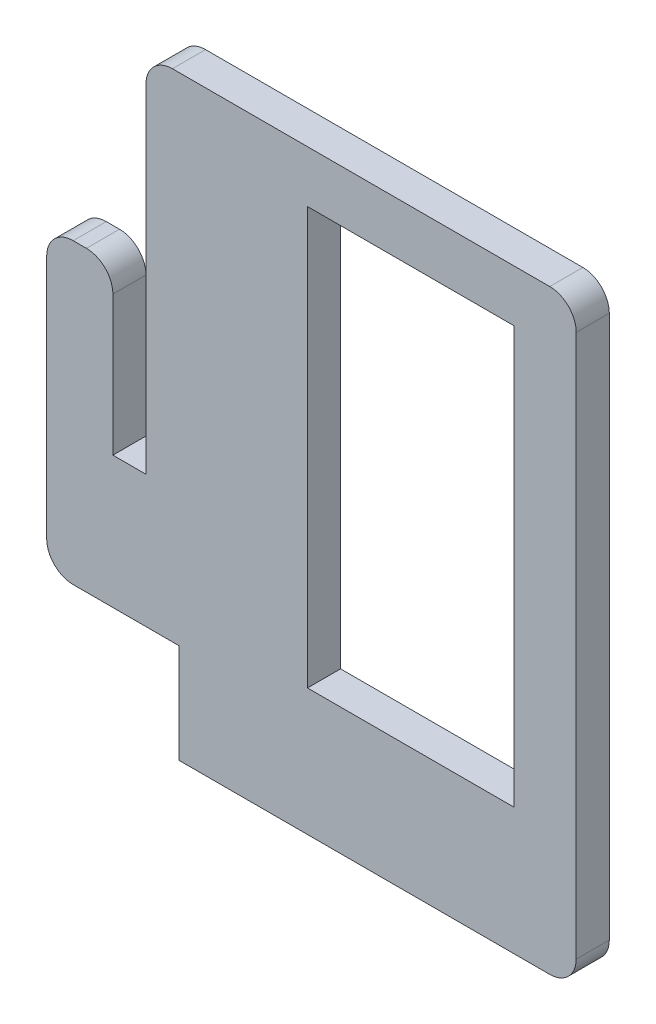
ISO-10303-21;
HEADER;
FILE_DESCRIPTION(('STEP AP214'),'2;1');
FILE_NAME('part.step','',(''),(''),'','','');
FILE_SCHEMA(('AUTOMOTIVE_DESIGN { 1 0 10303 214 1 1 1 1 }'));
ENDSEC;
DATA;
#1=APPLICATION_CONTEXT('core data for automotive mechanical design processes');
#2=APPLICATION_PROTOCOL_DEFINITION('international standard','automotive_design',2000,#1);
#3=PRODUCT_CONTEXT('',#1,'mechanical');
#4=PRODUCT('Part','Part','',(#3));
#5=PRODUCT_RELATED_PRODUCT_CATEGORY('part','',(#4));
#6=PRODUCT_DEFINITION_FORMATION('','',#4);
#7=PRODUCT_DEFINITION_CONTEXT('part definition',#1,'design');
#8=PRODUCT_DEFINITION('design','',#6,#7);
#9=PRODUCT_DEFINITION_SHAPE('','',#8);
#10=(LENGTH_UNIT() NAMED_UNIT(*) SI_UNIT(.MILLI.,.METRE.));
#11=(NAMED_UNIT(*) PLANE_ANGLE_UNIT() SI_UNIT($,.RADIAN.));
#12=(NAMED_UNIT(*) SI_UNIT($,.STERADIAN.) SOLID_ANGLE_UNIT());
#13=UNCERTAINTY_MEASURE_WITH_UNIT(LENGTH_MEASURE(1.E-05),#10,'distance_accuracy_value','');
#14=(GEOMETRIC_REPRESENTATION_CONTEXT(3) GLOBAL_UNCERTAINTY_ASSIGNED_CONTEXT((#13)) GLOBAL_UNIT_ASSIGNED_CONTEXT((#10,
#11,#12)) REPRESENTATION_CONTEXT('',''));
#15=CARTESIAN_POINT('',(0.,0.,0.));
#16=DIRECTION('',(0.,0.,1.));
#17=DIRECTION('',(1.,0.,0.));
#18=AXIS2_PLACEMENT_3D('',#15,#16,#17);
#19=CARTESIAN_POINT('',(0.,0.,3.175));
#20=DIRECTION('',(0.,0.,-1.));
#21=DIRECTION('',(-1.,0.,0.));
#22=AXIS2_PLACEMENT_3D('',#19,#20,#21);
#23=PLANE('',#22);
#24=DIRECTION('',(0.,-1.,0.));
#25=VECTOR('',#24,1.);
#26=CARTESIAN_POINT('',(0.,9.52499999999999,3.175));
#27=LINE('',#26,#25);
#28=CARTESIAN_POINT('',(0.,35.56,3.175));
#29=VERTEX_POINT('',#28);
#30=CARTESIAN_POINT('',(0.,12.065,3.175));
#31=VERTEX_POINT('',#30);
#32=EDGE_CURVE('E230',#29,#31,#27,.T.);
#33=ORIENTED_EDGE('',*,*,#32,.T.);
#34=CARTESIAN_POINT('',(2.54,12.065,3.175));
#35=DIRECTION('',(0.,0.,-1.));
#36=DIRECTION('',(-1.,0.,0.));
#37=AXIS2_PLACEMENT_3D('',#34,#35,#36);
#38=CIRCLE('',#37,2.54);
#39=CARTESIAN_POINT('',(2.54,9.52499999999999,3.175));
#40=VERTEX_POINT('',#39);
#41=EDGE_CURVE('E303',#31,#40,#38,.F.);
#42=ORIENTED_EDGE('',*,*,#41,.T.);
#43=DIRECTION('',(1.,0.,0.));
#44=VECTOR('',#43,1.);
#45=CARTESIAN_POINT('',(0.,9.52499999999999,3.175));
#46=LINE('',#45,#44);
#47=CARTESIAN_POINT('',(12.7,9.52499999999999,3.175));
#48=VERTEX_POINT('',#47);
#49=EDGE_CURVE('E233',#40,#48,#46,.T.);
#50=ORIENTED_EDGE('',*,*,#49,.T.);
#51=DIRECTION('',(0.,-1.,0.));
#52=VECTOR('',#51,1.);
#53=CARTESIAN_POINT('',(12.7,0.,3.175));
#54=LINE('',#53,#52);
#55=CARTESIAN_POINT('',(12.7,0.,3.175));
#56=VERTEX_POINT('',#55);
#57=EDGE_CURVE('E235',#48,#56,#54,.T.);
#58=ORIENTED_EDGE('',*,*,#57,.T.);
#59=DIRECTION('',(1.,0.,0.));
#60=VECTOR('',#59,1.);
#61=CARTESIAN_POINT('',(12.7,0.,3.175));
#62=LINE('',#61,#60);
#63=CARTESIAN_POINT('',(48.26,0.,3.175));
#64=VERTEX_POINT('',#63);
#65=EDGE_CURVE('E237',#56,#64,#62,.T.);
#66=ORIENTED_EDGE('',*,*,#65,.T.);
#67=CARTESIAN_POINT('',(48.26,2.53999999999999,3.175));
#68=DIRECTION('',(0.,0.,-1.));
#69=DIRECTION('',(-1.,0.,0.));
#70=AXIS2_PLACEMENT_3D('',#67,#68,#69);
#71=CIRCLE('',#70,2.54);
#72=CARTESIAN_POINT('',(50.8,2.53999999999999,3.175));
#73=VERTEX_POINT('',#72);
#74=EDGE_CURVE('E295',#64,#73,#71,.F.);
#75=ORIENTED_EDGE('',*,*,#74,.T.);
#76=DIRECTION('',(0.,1.,0.));
#77=VECTOR('',#76,1.);
#78=CARTESIAN_POINT('',(50.8,38.1,3.175));
#79=LINE('',#78,#77);
#80=CARTESIAN_POINT('',(50.8,54.61,3.175));
#81=VERTEX_POINT('',#80);
#82=EDGE_CURVE('E214',#73,#81,#79,.T.);
#83=ORIENTED_EDGE('',*,*,#82,.T.);
#84=CARTESIAN_POINT('',(48.26,54.61,3.175));
#85=DIRECTION('',(0.,0.,-1.));
#86=DIRECTION('',(-1.,0.,0.));
#87=AXIS2_PLACEMENT_3D('',#84,#85,#86);
#88=CIRCLE('',#87,2.54);
#89=CARTESIAN_POINT('',(48.26,57.15,3.175));
#90=VERTEX_POINT('',#89);
#91=EDGE_CURVE('E293',#81,#90,#88,.F.);
#92=ORIENTED_EDGE('',*,*,#91,.T.);
#93=DIRECTION('',(-1.,0.,0.));
#94=VECTOR('',#93,1.);
#95=CARTESIAN_POINT('',(9.525,57.15,3.175));
#96=LINE('',#95,#94);
#97=CARTESIAN_POINT('',(12.065,57.15,3.175));
#98=VERTEX_POINT('',#97);
#99=EDGE_CURVE('E217',#90,#98,#96,.T.);
#100=ORIENTED_EDGE('',*,*,#99,.T.);
#101=CARTESIAN_POINT('',(12.065,54.61,3.175));
#102=DIRECTION('',(0.,0.,-1.));
#103=DIRECTION('',(-1.,0.,0.));
#104=AXIS2_PLACEMENT_3D('',#101,#102,#103);
#105=CIRCLE('',#104,2.54);
#106=CARTESIAN_POINT('',(9.525,54.61,3.175));
#107=VERTEX_POINT('',#106);
#108=EDGE_CURVE('E297',#98,#107,#105,.F.);
#109=ORIENTED_EDGE('',*,*,#108,.T.);
#110=DIRECTION('',(0.,-1.,0.));
#111=VECTOR('',#110,1.);
#112=CARTESIAN_POINT('',(9.525,38.1,3.175));
#113=LINE('',#112,#111);
#114=CARTESIAN_POINT('',(9.525,22.1847852625298,3.175));
#115=VERTEX_POINT('',#114);
#116=EDGE_CURVE('E221',#107,#115,#113,.T.);
#117=ORIENTED_EDGE('',*,*,#116,.T.);
#118=DIRECTION('',(-1.,0.,0.));
#119=VECTOR('',#118,1.);
#120=CARTESIAN_POINT('',(6.35,22.1847852625298,3.175));
#121=LINE('',#120,#119);
#122=CARTESIAN_POINT('',(6.35,22.1847852625298,3.175));
#123=VERTEX_POINT('',#122);
#124=EDGE_CURVE('E223',#115,#123,#121,.T.);
#125=ORIENTED_EDGE('',*,*,#124,.T.);
#126=DIRECTION('',(0.,1.,0.));
#127=VECTOR('',#126,1.);
#128=CARTESIAN_POINT('',(6.35,38.1,3.175));
#129=LINE('',#128,#127);
#130=CARTESIAN_POINT('',(6.35,35.56,3.175));
#131=VERTEX_POINT('',#130);
#132=EDGE_CURVE('E225',#123,#131,#129,.T.);
#133=ORIENTED_EDGE('',*,*,#132,.T.);
#134=CARTESIAN_POINT('',(3.81,35.56,3.175));
#135=DIRECTION('',(0.,0.,-1.));
#136=DIRECTION('',(-1.,0.,0.));
#137=AXIS2_PLACEMENT_3D('',#134,#135,#136);
#138=CIRCLE('',#137,2.54);
#139=CARTESIAN_POINT('',(3.81,38.1,3.175));
#140=VERTEX_POINT('',#139);
#141=EDGE_CURVE('E301',#131,#140,#138,.F.);
#142=ORIENTED_EDGE('',*,*,#141,.T.);
#143=DIRECTION('',(-1.,0.,0.));
#144=VECTOR('',#143,1.);
#145=CARTESIAN_POINT('',(0.,38.1,3.175));
#146=LINE('',#145,#144);
#147=CARTESIAN_POINT('',(2.54,38.1,3.175));
#148=VERTEX_POINT('',#147);
#149=EDGE_CURVE('E228',#140,#148,#146,.T.);
#150=ORIENTED_EDGE('',*,*,#149,.T.);
#151=CARTESIAN_POINT('',(2.54,35.56,3.175));
#152=DIRECTION('',(0.,0.,-1.));
#153=DIRECTION('',(-1.,0.,0.));
#154=AXIS2_PLACEMENT_3D('',#151,#152,#153);
#155=CIRCLE('',#154,2.54);
#156=EDGE_CURVE('E299',#148,#29,#155,.F.);
#157=ORIENTED_EDGE('',*,*,#156,.T.);
#158=EDGE_LOOP('',(#33,#42,#50,#58,#66,#75,#83,#92,#100,#109,#117,#125,#133,#142,#150,#157));
#159=FACE_BOUND('',#158,.T.);
#160=DIRECTION('',(0.,1.,0.));
#161=VECTOR('',#160,1.);
#162=CARTESIAN_POINT('',(44.831,52.1771852625298,3.175));
#163=LINE('',#162,#161);
#164=CARTESIAN_POINT('',(44.831,12.1771852625298,3.175));
#165=VERTEX_POINT('',#164);
#166=CARTESIAN_POINT('',(44.831,52.1771852625298,3.175));
#167=VERTEX_POINT('',#166);
#168=EDGE_CURVE('E173',#165,#167,#163,.T.);
#169=ORIENTED_EDGE('',*,*,#168,.F.);
#170=DIRECTION('',(1.,0.,0.));
#171=VECTOR('',#170,1.);
#172=CARTESIAN_POINT('',(25.019,12.1771852625298,3.175));
#173=LINE('',#172,#171);
#174=CARTESIAN_POINT('',(25.019,12.1771852625298,3.175));
#175=VERTEX_POINT('',#174);
#176=EDGE_CURVE('E198',#175,#165,#173,.T.);
#177=ORIENTED_EDGE('',*,*,#176,.F.);
#178=DIRECTION('',(0.,-1.,0.));
#179=VECTOR('',#178,1.);
#180=CARTESIAN_POINT('',(25.019,52.1771852625298,3.175));
#181=LINE('',#180,#179);
#182=CARTESIAN_POINT('',(25.019,52.1771852625298,3.175));
#183=VERTEX_POINT('',#182);
#184=EDGE_CURVE('E196',#183,#175,#181,.T.);
#185=ORIENTED_EDGE('',*,*,#184,.F.);
#186=DIRECTION('',(-1.,0.,0.));
#187=VECTOR('',#186,1.);
#188=CARTESIAN_POINT('',(25.019,52.1771852625298,3.175));
#189=LINE('',#188,#187);
#190=EDGE_CURVE('E183',#167,#183,#189,.T.);
#191=ORIENTED_EDGE('',*,*,#190,.F.);
#192=EDGE_LOOP('',(#169,#177,#185,#191));
#193=FACE_BOUND('',#192,.T.);
#194=ADVANCED_FACE('F33',(#159,#193),#23,.F.);
#195=CARTESIAN_POINT('',(0.,0.,0.));
#196=DIRECTION('',(0.,0.,-1.));
#197=DIRECTION('',(-1.,0.,0.));
#198=AXIS2_PLACEMENT_3D('',#195,#196,#197);
#199=PLANE('',#198);
#200=DIRECTION('',(1.,0.,0.));
#201=VECTOR('',#200,1.);
#202=CARTESIAN_POINT('',(0.,9.52499999999999,0.));
#203=LINE('',#202,#201);
#204=CARTESIAN_POINT('',(2.54,9.52499999999999,0.));
#205=VERTEX_POINT('',#204);
#206=CARTESIAN_POINT('',(12.7,9.52499999999999,0.));
#207=VERTEX_POINT('',#206);
#208=EDGE_CURVE('E254',#205,#207,#203,.T.);
#209=ORIENTED_EDGE('',*,*,#208,.F.);
#210=CARTESIAN_POINT('',(2.54,12.065,0.));
#211=DIRECTION('',(0.,0.,-1.));
#212=DIRECTION('',(-1.,0.,0.));
#213=AXIS2_PLACEMENT_3D('',#210,#211,#212);
#214=CIRCLE('',#213,2.54);
#215=CARTESIAN_POINT('',(0.,12.065,0.));
#216=VERTEX_POINT('',#215);
#217=EDGE_CURVE('E286',#205,#216,#214,.T.);
#218=ORIENTED_EDGE('',*,*,#217,.T.);
#219=DIRECTION('',(0.,-1.,0.));
#220=VECTOR('',#219,1.);
#221=CARTESIAN_POINT('',(0.,9.52499999999999,0.));
#222=LINE('',#221,#220);
#223=CARTESIAN_POINT('',(0.,35.56,0.));
#224=VERTEX_POINT('',#223);
#225=EDGE_CURVE('E251',#224,#216,#222,.T.);
#226=ORIENTED_EDGE('',*,*,#225,.F.);
#227=CARTESIAN_POINT('',(2.54,35.56,0.));
#228=DIRECTION('',(0.,0.,-1.));
#229=DIRECTION('',(-1.,0.,0.));
#230=AXIS2_PLACEMENT_3D('',#227,#228,#229);
#231=CIRCLE('',#230,2.54);
#232=CARTESIAN_POINT('',(2.54,38.1,0.));
#233=VERTEX_POINT('',#232);
#234=EDGE_CURVE('E282',#224,#233,#231,.T.);
#235=ORIENTED_EDGE('',*,*,#234,.T.);
#236=DIRECTION('',(-1.,0.,0.));
#237=VECTOR('',#236,1.);
#238=CARTESIAN_POINT('',(0.,38.1,0.));
#239=LINE('',#238,#237);
#240=CARTESIAN_POINT('',(3.81,38.1,0.));
#241=VERTEX_POINT('',#240);
#242=EDGE_CURVE('E249',#241,#233,#239,.T.);
#243=ORIENTED_EDGE('',*,*,#242,.F.);
#244=CARTESIAN_POINT('',(3.81,35.56,0.));
#245=DIRECTION('',(0.,0.,-1.));
#246=DIRECTION('',(-1.,0.,0.));
#247=AXIS2_PLACEMENT_3D('',#244,#245,#246);
#248=CIRCLE('',#247,2.54);
#249=CARTESIAN_POINT('',(6.35,35.56,0.));
#250=VERTEX_POINT('',#249);
#251=EDGE_CURVE('E284',#241,#250,#248,.T.);
#252=ORIENTED_EDGE('',*,*,#251,.T.);
#253=DIRECTION('',(0.,1.,0.));
#254=VECTOR('',#253,1.);
#255=CARTESIAN_POINT('',(6.35,38.1,0.));
#256=LINE('',#255,#254);
#257=CARTESIAN_POINT('',(6.35,22.1847852625298,0.));
#258=VERTEX_POINT('',#257);
#259=EDGE_CURVE('E246',#258,#250,#256,.T.);
#260=ORIENTED_EDGE('',*,*,#259,.F.);
#261=DIRECTION('',(-1.,0.,0.));
#262=VECTOR('',#261,1.);
#263=CARTESIAN_POINT('',(6.35,22.1847852625298,0.));
#264=LINE('',#263,#262);
#265=CARTESIAN_POINT('',(9.525,22.1847852625298,0.));
#266=VERTEX_POINT('',#265);
#267=EDGE_CURVE('E244',#266,#258,#264,.T.);
#268=ORIENTED_EDGE('',*,*,#267,.F.);
#269=DIRECTION('',(0.,-1.,0.));
#270=VECTOR('',#269,1.);
#271=CARTESIAN_POINT('',(9.525,38.1,0.));
#272=LINE('',#271,#270);
#273=CARTESIAN_POINT('',(9.525,54.61,0.));
#274=VERTEX_POINT('',#273);
#275=EDGE_CURVE('E242',#274,#266,#272,.T.);
#276=ORIENTED_EDGE('',*,*,#275,.F.);
#277=CARTESIAN_POINT('',(12.065,54.61,0.));
#278=DIRECTION('',(0.,0.,-1.));
#279=DIRECTION('',(-1.,0.,0.));
#280=AXIS2_PLACEMENT_3D('',#277,#278,#279);
#281=CIRCLE('',#280,2.54);
#282=CARTESIAN_POINT('',(12.065,57.15,0.));
#283=VERTEX_POINT('',#282);
#284=EDGE_CURVE('E280',#274,#283,#281,.T.);
#285=ORIENTED_EDGE('',*,*,#284,.T.);
#286=DIRECTION('',(-1.,0.,0.));
#287=VECTOR('',#286,1.);
#288=CARTESIAN_POINT('',(9.525,57.15,0.));
#289=LINE('',#288,#287);
#290=CARTESIAN_POINT('',(48.26,57.15,0.));
#291=VERTEX_POINT('',#290);
#292=EDGE_CURVE('E191',#291,#283,#289,.T.);
#293=ORIENTED_EDGE('',*,*,#292,.F.);
#294=CARTESIAN_POINT('',(48.26,54.61,0.));
#295=DIRECTION('',(0.,0.,-1.));
#296=DIRECTION('',(-1.,0.,0.));
#297=AXIS2_PLACEMENT_3D('',#294,#295,#296);
#298=CIRCLE('',#297,2.54);
#299=CARTESIAN_POINT('',(50.8,54.61,0.));
#300=VERTEX_POINT('',#299);
#301=EDGE_CURVE('E276',#291,#300,#298,.T.);
#302=ORIENTED_EDGE('',*,*,#301,.T.);
#303=DIRECTION('',(0.,1.,0.));
#304=VECTOR('',#303,1.);
#305=CARTESIAN_POINT('',(50.8,0.,0.));
#306=LINE('',#305,#304);
#307=CARTESIAN_POINT('',(50.8,2.53999999999999,0.));
#308=VERTEX_POINT('',#307);
#309=EDGE_CURVE('E218',#308,#300,#306,.T.);
#310=ORIENTED_EDGE('',*,*,#309,.F.);
#311=CARTESIAN_POINT('',(48.26,2.53999999999999,0.));
#312=DIRECTION('',(0.,0.,-1.));
#313=DIRECTION('',(-1.,0.,0.));
#314=AXIS2_PLACEMENT_3D('',#311,#312,#313);
#315=CIRCLE('',#314,2.54);
#316=CARTESIAN_POINT('',(48.26,0.,0.));
#317=VERTEX_POINT('',#316);
#318=EDGE_CURVE('E278',#308,#317,#315,.T.);
#319=ORIENTED_EDGE('',*,*,#318,.T.);
#320=DIRECTION('',(1.,0.,0.));
#321=VECTOR('',#320,1.);
#322=CARTESIAN_POINT('',(12.7,0.,0.));
#323=LINE('',#322,#321);
#324=CARTESIAN_POINT('',(12.7,0.,0.));
#325=VERTEX_POINT('',#324);
#326=EDGE_CURVE('E258',#325,#317,#323,.T.);
#327=ORIENTED_EDGE('',*,*,#326,.F.);
#328=DIRECTION('',(0.,-1.,0.));
#329=VECTOR('',#328,1.);
#330=CARTESIAN_POINT('',(12.7,0.,0.));
#331=LINE('',#330,#329);
#332=EDGE_CURVE('E256',#207,#325,#331,.T.);
#333=ORIENTED_EDGE('',*,*,#332,.F.);
#334=EDGE_LOOP('',(#209,#218,#226,#235,#243,#252,#260,#268,#276,#285,#293,#302,#310,#319,#327,#333));
#335=FACE_BOUND('',#334,.T.);
#336=DIRECTION('',(1.,0.,0.));
#337=VECTOR('',#336,1.);
#338=CARTESIAN_POINT('',(25.019,12.1771852625298,0.));
#339=LINE('',#338,#337);
#340=CARTESIAN_POINT('',(25.019,12.1771852625298,0.));
#341=VERTEX_POINT('',#340);
#342=CARTESIAN_POINT('',(44.831,12.1771852625298,0.));
#343=VERTEX_POINT('',#342);
#344=EDGE_CURVE('E184',#341,#343,#339,.T.);
#345=ORIENTED_EDGE('',*,*,#344,.T.);
#346=DIRECTION('',(0.,1.,0.));
#347=VECTOR('',#346,1.);
#348=CARTESIAN_POINT('',(44.831,52.1771852625298,0.));
#349=LINE('',#348,#347);
#350=CARTESIAN_POINT('',(44.831,52.1771852625298,0.));
#351=VERTEX_POINT('',#350);
#352=EDGE_CURVE('E202',#343,#351,#349,.T.);
#353=ORIENTED_EDGE('',*,*,#352,.T.);
#354=DIRECTION('',(-1.,0.,0.));
#355=VECTOR('',#354,1.);
#356=CARTESIAN_POINT('',(25.019,52.1771852625298,0.));
#357=LINE('',#356,#355);
#358=CARTESIAN_POINT('',(25.019,52.1771852625298,0.));
#359=VERTEX_POINT('',#358);
#360=EDGE_CURVE('E190',#351,#359,#357,.T.);
#361=ORIENTED_EDGE('',*,*,#360,.T.);
#362=DIRECTION('',(0.,-1.,0.));
#363=VECTOR('',#362,1.);
#364=CARTESIAN_POINT('',(25.019,52.1771852625298,0.));
#365=LINE('',#364,#363);
#366=EDGE_CURVE('E205',#359,#341,#365,.T.);
#367=ORIENTED_EDGE('',*,*,#366,.T.);
#368=EDGE_LOOP('',(#345,#353,#361,#367));
#369=FACE_BOUND('',#368,.T.);
#370=ADVANCED_FACE('F331',(#335,#369),#199,.T.);
#371=CARTESIAN_POINT('',(9.525,57.15,3.175));
#372=DIRECTION('',(0.,-1.,0.));
#373=DIRECTION('',(0.,0.,-1.));
#374=AXIS2_PLACEMENT_3D('',#371,#372,#373);
#375=PLANE('',#374);
#376=ORIENTED_EDGE('',*,*,#292,.T.);
#377=DIRECTION('',(0.,0.,-1.));
#378=VECTOR('',#377,1.);
#379=CARTESIAN_POINT('',(12.065,57.15,3.175));
#380=LINE('',#379,#378);
#381=EDGE_CURVE('E317',#283,#98,#380,.F.);
#382=ORIENTED_EDGE('',*,*,#381,.T.);
#383=ORIENTED_EDGE('',*,*,#99,.F.);
#384=DIRECTION('',(0.,0.,-1.));
#385=VECTOR('',#384,1.);
#386=CARTESIAN_POINT('',(48.26,57.15,3.175));
#387=LINE('',#386,#385);
#388=EDGE_CURVE('E314',#90,#291,#387,.T.);
#389=ORIENTED_EDGE('',*,*,#388,.T.);
#390=EDGE_LOOP('',(#376,#382,#383,#389));
#391=FACE_BOUND('',#390,.T.);
#392=ADVANCED_FACE('F340',(#391),#375,.F.);
#393=CARTESIAN_POINT('',(9.525,38.1,3.175));
#394=DIRECTION('',(1.,0.,0.));
#395=DIRECTION('',(0.,1.,0.));
#396=AXIS2_PLACEMENT_3D('',#393,#394,#395);
#397=PLANE('',#396);
#398=ORIENTED_EDGE('',*,*,#116,.F.);
#399=DIRECTION('',(0.,0.,-1.));
#400=VECTOR('',#399,1.);
#401=CARTESIAN_POINT('',(9.525,54.61,3.175));
#402=LINE('',#401,#400);
#403=EDGE_CURVE('E311',#107,#274,#402,.T.);
#404=ORIENTED_EDGE('',*,*,#403,.T.);
#405=ORIENTED_EDGE('',*,*,#275,.T.);
#406=DIRECTION('',(0.,0.,-1.));
#407=VECTOR('',#406,1.);
#408=CARTESIAN_POINT('',(9.525,22.1847852625298,3.175));
#409=LINE('',#408,#407);
#410=EDGE_CURVE('E270',#115,#266,#409,.T.);
#411=ORIENTED_EDGE('',*,*,#410,.F.);
#412=EDGE_LOOP('',(#398,#404,#405,#411));
#413=FACE_BOUND('',#412,.T.);
#414=ADVANCED_FACE('F350',(#413),#397,.F.);
#415=CARTESIAN_POINT('',(6.35,22.1847852625298,3.175));
#416=DIRECTION('',(0.,-1.,0.));
#417=DIRECTION('',(0.,0.,-1.));
#418=AXIS2_PLACEMENT_3D('',#415,#416,#417);
#419=PLANE('',#418);
#420=ORIENTED_EDGE('',*,*,#267,.T.);
#421=DIRECTION('',(0.,0.,-1.));
#422=VECTOR('',#421,1.);
#423=CARTESIAN_POINT('',(6.35,22.1847852625298,3.175));
#424=LINE('',#423,#422);
#425=EDGE_CURVE('E267',#123,#258,#424,.T.);
#426=ORIENTED_EDGE('',*,*,#425,.F.);
#427=ORIENTED_EDGE('',*,*,#124,.F.);
#428=ORIENTED_EDGE('',*,*,#410,.T.);
#429=EDGE_LOOP('',(#420,#426,#427,#428));
#430=FACE_BOUND('',#429,.T.);
#431=ADVANCED_FACE('F356',(#430),#419,.F.);
#432=CARTESIAN_POINT('',(6.35,38.1,3.175));
#433=DIRECTION('',(-1.,0.,0.));
#434=DIRECTION('',(0.,-1.,0.));
#435=AXIS2_PLACEMENT_3D('',#432,#433,#434);
#436=PLANE('',#435);
#437=ORIENTED_EDGE('',*,*,#259,.T.);
#438=DIRECTION('',(0.,0.,-1.));
#439=VECTOR('',#438,1.);
#440=CARTESIAN_POINT('',(6.35,35.56,3.175));
#441=LINE('',#440,#439);
#442=EDGE_CURVE('E309',#250,#131,#441,.F.);
#443=ORIENTED_EDGE('',*,*,#442,.T.);
#444=ORIENTED_EDGE('',*,*,#132,.F.);
#445=ORIENTED_EDGE('',*,*,#425,.T.);
#446=EDGE_LOOP('',(#437,#443,#444,#445));
#447=FACE_BOUND('',#446,.T.);
#448=ADVANCED_FACE('F360',(#447),#436,.F.);
#449=CARTESIAN_POINT('',(0.,38.1,3.175));
#450=DIRECTION('',(0.,-1.,0.));
#451=DIRECTION('',(0.,0.,-1.));
#452=AXIS2_PLACEMENT_3D('',#449,#450,#451);
#453=PLANE('',#452);
#454=ORIENTED_EDGE('',*,*,#149,.F.);
#455=DIRECTION('',(0.,0.,-1.));
#456=VECTOR('',#455,1.);
#457=CARTESIAN_POINT('',(3.81,38.1,3.175));
#458=LINE('',#457,#456);
#459=EDGE_CURVE('E306',#140,#241,#458,.T.);
#460=ORIENTED_EDGE('',*,*,#459,.T.);
#461=ORIENTED_EDGE('',*,*,#242,.T.);
#462=DIRECTION('',(0.,0.,-1.));
#463=VECTOR('',#462,1.);
#464=CARTESIAN_POINT('',(2.54,38.1,3.175));
#465=LINE('',#464,#463);
#466=EDGE_CURVE('E54',#233,#148,#465,.F.);
#467=ORIENTED_EDGE('',*,*,#466,.T.);
#468=EDGE_LOOP('',(#454,#460,#461,#467));
#469=FACE_BOUND('',#468,.T.);
#470=ADVANCED_FACE('F367',(#469),#453,.F.);
#471=CARTESIAN_POINT('',(0.,9.52499999999999,3.175));
#472=DIRECTION('',(1.,0.,0.));
#473=DIRECTION('',(0.,0.,-1.));
#474=AXIS2_PLACEMENT_3D('',#471,#472,#473);
#475=PLANE('',#474);
#476=ORIENTED_EDGE('',*,*,#225,.T.);
#477=DIRECTION('',(0.,0.,-1.));
#478=VECTOR('',#477,1.);
#479=CARTESIAN_POINT('',(0.,12.065,3.175));
#480=LINE('',#479,#478);
#481=EDGE_CURVE('E291',#216,#31,#480,.F.);
#482=ORIENTED_EDGE('',*,*,#481,.T.);
#483=ORIENTED_EDGE('',*,*,#32,.F.);
#484=DIRECTION('',(0.,0.,-1.));
#485=VECTOR('',#484,1.);
#486=CARTESIAN_POINT('',(0.,35.56,3.175));
#487=LINE('',#486,#485);
#488=EDGE_CURVE('E288',#29,#224,#487,.T.);
#489=ORIENTED_EDGE('',*,*,#488,.T.);
#490=EDGE_LOOP('',(#476,#482,#483,#489));
#491=FACE_BOUND('',#490,.T.);
#492=ADVANCED_FACE('F375',(#491),#475,.F.);
#493=CARTESIAN_POINT('',(0.,9.52499999999999,3.175));
#494=DIRECTION('',(0.,1.,0.));
#495=DIRECTION('',(0.,0.,1.));
#496=AXIS2_PLACEMENT_3D('',#493,#494,#495);
#497=PLANE('',#496);
#498=ORIENTED_EDGE('',*,*,#49,.F.);
#499=DIRECTION('',(0.,0.,-1.));
#500=VECTOR('',#499,1.);
#501=CARTESIAN_POINT('',(2.54,9.52499999999999,3.175));
#502=LINE('',#501,#500);
#503=EDGE_CURVE('E273',#40,#205,#502,.T.);
#504=ORIENTED_EDGE('',*,*,#503,.T.);
#505=ORIENTED_EDGE('',*,*,#208,.T.);
#506=DIRECTION('',(0.,0.,-1.));
#507=VECTOR('',#506,1.);
#508=CARTESIAN_POINT('',(12.7,9.52499999999999,3.175));
#509=LINE('',#508,#507);
#510=EDGE_CURVE('E264',#48,#207,#509,.T.);
#511=ORIENTED_EDGE('',*,*,#510,.F.);
#512=EDGE_LOOP('',(#498,#504,#505,#511));
#513=FACE_BOUND('',#512,.T.);
#514=ADVANCED_FACE('F383',(#513),#497,.F.);
#515=CARTESIAN_POINT('',(12.7,0.,3.175));
#516=DIRECTION('',(1.,0.,0.));
#517=DIRECTION('',(0.,0.,-1.));
#518=AXIS2_PLACEMENT_3D('',#515,#516,#517);
#519=PLANE('',#518);
#520=ORIENTED_EDGE('',*,*,#332,.T.);
#521=DIRECTION('',(0.,0.,-1.));
#522=VECTOR('',#521,1.);
#523=CARTESIAN_POINT('',(12.7,0.,3.175));
#524=LINE('',#523,#522);
#525=EDGE_CURVE('E239',#56,#325,#524,.T.);
#526=ORIENTED_EDGE('',*,*,#525,.F.);
#527=ORIENTED_EDGE('',*,*,#57,.F.);
#528=ORIENTED_EDGE('',*,*,#510,.T.);
#529=EDGE_LOOP('',(#520,#526,#527,#528));
#530=FACE_BOUND('',#529,.T.);
#531=ADVANCED_FACE('F388',(#530),#519,.F.);
#532=CARTESIAN_POINT('',(12.7,0.,3.175));
#533=DIRECTION('',(0.,1.,0.));
#534=DIRECTION('',(0.,0.,1.));
#535=AXIS2_PLACEMENT_3D('',#532,#533,#534);
#536=PLANE('',#535);
#537=ORIENTED_EDGE('',*,*,#326,.T.);
#538=DIRECTION('',(0.,0.,-1.));
#539=VECTOR('',#538,1.);
#540=CARTESIAN_POINT('',(48.26,0.,3.175));
#541=LINE('',#540,#539);
#542=EDGE_CURVE('E11',#317,#64,#541,.F.);
#543=ORIENTED_EDGE('',*,*,#542,.T.);
#544=ORIENTED_EDGE('',*,*,#65,.F.);
#545=ORIENTED_EDGE('',*,*,#525,.T.);
#546=EDGE_LOOP('',(#537,#543,#544,#545));
#547=FACE_BOUND('',#546,.T.);
#548=ADVANCED_FACE('F390',(#547),#536,.F.);
#549=CARTESIAN_POINT('',(50.8,0.,3.175));
#550=DIRECTION('',(-1.,0.,0.));
#551=DIRECTION('',(0.,0.,1.));
#552=AXIS2_PLACEMENT_3D('',#549,#550,#551);
#553=PLANE('',#552);
#554=ORIENTED_EDGE('',*,*,#82,.F.);
#555=DIRECTION('',(0.,0.,-1.));
#556=VECTOR('',#555,1.);
#557=CARTESIAN_POINT('',(50.8,2.53999999999999,3.175));
#558=LINE('',#557,#556);
#559=EDGE_CURVE('E41',#73,#308,#558,.T.);
#560=ORIENTED_EDGE('',*,*,#559,.T.);
#561=ORIENTED_EDGE('',*,*,#309,.T.);
#562=DIRECTION('',(0.,0.,-1.));
#563=VECTOR('',#562,1.);
#564=CARTESIAN_POINT('',(50.8,54.61,3.175));
#565=LINE('',#564,#563);
#566=EDGE_CURVE('E319',#300,#81,#565,.F.);
#567=ORIENTED_EDGE('',*,*,#566,.T.);
#568=EDGE_LOOP('',(#554,#560,#561,#567));
#569=FACE_BOUND('',#568,.T.);
#570=ADVANCED_FACE('F325',(#569),#553,.F.);
#571=CARTESIAN_POINT('',(44.831,52.1771852625298,3.175));
#572=DIRECTION('',(-1.,0.,0.));
#573=DIRECTION('',(0.,-1.,0.));
#574=AXIS2_PLACEMENT_3D('',#571,#572,#573);
#575=PLANE('',#574);
#576=ORIENTED_EDGE('',*,*,#352,.F.);
#577=DIRECTION('',(0.,0.,-1.));
#578=VECTOR('',#577,1.);
#579=CARTESIAN_POINT('',(44.831,12.1771852625298,3.175));
#580=LINE('',#579,#578);
#581=EDGE_CURVE('E179',#165,#343,#580,.T.);
#582=ORIENTED_EDGE('',*,*,#581,.F.);
#583=ORIENTED_EDGE('',*,*,#168,.T.);
#584=DIRECTION('',(0.,0.,-1.));
#585=VECTOR('',#584,1.);
#586=CARTESIAN_POINT('',(44.831,52.1771852625298,3.175));
#587=LINE('',#586,#585);
#588=EDGE_CURVE('E176',#167,#351,#587,.T.);
#589=ORIENTED_EDGE('',*,*,#588,.T.);
#590=EDGE_LOOP('',(#576,#582,#583,#589));
#591=FACE_BOUND('',#590,.T.);
#592=ADVANCED_FACE('F175',(#591),#575,.T.);
#593=CARTESIAN_POINT('',(25.019,52.1771852625298,3.175));
#594=DIRECTION('',(0.,-1.,0.));
#595=DIRECTION('',(1.,0.,0.));
#596=AXIS2_PLACEMENT_3D('',#593,#594,#595);
#597=PLANE('',#596);
#598=ORIENTED_EDGE('',*,*,#360,.F.);
#599=ORIENTED_EDGE('',*,*,#588,.F.);
#600=ORIENTED_EDGE('',*,*,#190,.T.);
#601=DIRECTION('',(0.,0.,-1.));
#602=VECTOR('',#601,1.);
#603=CARTESIAN_POINT('',(25.019,52.1771852625298,3.175));
#604=LINE('',#603,#602);
#605=EDGE_CURVE('E192',#183,#359,#604,.T.);
#606=ORIENTED_EDGE('',*,*,#605,.T.);
#607=EDGE_LOOP('',(#598,#599,#600,#606));
#608=FACE_BOUND('',#607,.T.);
#609=ADVANCED_FACE('F187',(#608),#597,.T.);
#610=CARTESIAN_POINT('',(25.019,52.1771852625298,3.175));
#611=DIRECTION('',(1.,0.,0.));
#612=DIRECTION('',(0.,1.,0.));
#613=AXIS2_PLACEMENT_3D('',#610,#611,#612);
#614=PLANE('',#613);
#615=ORIENTED_EDGE('',*,*,#366,.F.);
#616=ORIENTED_EDGE('',*,*,#605,.F.);
#617=ORIENTED_EDGE('',*,*,#184,.T.);
#618=DIRECTION('',(0.,0.,-1.));
#619=VECTOR('',#618,1.);
#620=CARTESIAN_POINT('',(25.019,12.1771852625298,3.175));
#621=LINE('',#620,#619);
#622=EDGE_CURVE('E211',#175,#341,#621,.T.);
#623=ORIENTED_EDGE('',*,*,#622,.T.);
#624=EDGE_LOOP('',(#615,#616,#617,#623));
#625=FACE_BOUND('',#624,.T.);
#626=ADVANCED_FACE('F473',(#625),#614,.T.);
#627=CARTESIAN_POINT('',(25.019,12.1771852625298,3.175));
#628=DIRECTION('',(0.,1.,0.));
#629=DIRECTION('',(0.,0.,1.));
#630=AXIS2_PLACEMENT_3D('',#627,#628,#629);
#631=PLANE('',#630);
#632=ORIENTED_EDGE('',*,*,#344,.F.);
#633=ORIENTED_EDGE('',*,*,#622,.F.);
#634=ORIENTED_EDGE('',*,*,#176,.T.);
#635=ORIENTED_EDGE('',*,*,#581,.T.);
#636=EDGE_LOOP('',(#632,#633,#634,#635));
#637=FACE_BOUND('',#636,.T.);
#638=ADVANCED_FACE('F429',(#637),#631,.T.);
#639=CARTESIAN_POINT('',(2.54,12.065,3.175));
#640=DIRECTION('',(0.,0.,-1.));
#641=DIRECTION('',(-1.,0.,0.));
#642=AXIS2_PLACEMENT_3D('',#639,#640,#641);
#643=CYLINDRICAL_SURFACE('',#642,2.54);
#644=ORIENTED_EDGE('',*,*,#41,.F.);
#645=ORIENTED_EDGE('',*,*,#481,.F.);
#646=ORIENTED_EDGE('',*,*,#217,.F.);
#647=ORIENTED_EDGE('',*,*,#503,.F.);
#648=EDGE_LOOP('',(#644,#645,#646,#647));
#649=FACE_BOUND('',#648,.T.);
#650=ADVANCED_FACE('F381',(#649),#643,.T.);
#651=CARTESIAN_POINT('',(3.81,35.56,3.175));
#652=DIRECTION('',(0.,0.,-1.));
#653=DIRECTION('',(-1.,0.,0.));
#654=AXIS2_PLACEMENT_3D('',#651,#652,#653);
#655=CYLINDRICAL_SURFACE('',#654,2.54);
#656=ORIENTED_EDGE('',*,*,#141,.F.);
#657=ORIENTED_EDGE('',*,*,#442,.F.);
#658=ORIENTED_EDGE('',*,*,#251,.F.);
#659=ORIENTED_EDGE('',*,*,#459,.F.);
#660=EDGE_LOOP('',(#656,#657,#658,#659));
#661=FACE_BOUND('',#660,.T.);
#662=ADVANCED_FACE('F365',(#661),#655,.T.);
#663=CARTESIAN_POINT('',(2.54,35.56,3.175));
#664=DIRECTION('',(0.,0.,-1.));
#665=DIRECTION('',(-1.,0.,0.));
#666=AXIS2_PLACEMENT_3D('',#663,#664,#665);
#667=CYLINDRICAL_SURFACE('',#666,2.54);
#668=ORIENTED_EDGE('',*,*,#156,.F.);
#669=ORIENTED_EDGE('',*,*,#466,.F.);
#670=ORIENTED_EDGE('',*,*,#234,.F.);
#671=ORIENTED_EDGE('',*,*,#488,.F.);
#672=EDGE_LOOP('',(#668,#669,#670,#671));
#673=FACE_BOUND('',#672,.T.);
#674=ADVANCED_FACE('F372',(#673),#667,.T.);
#675=CARTESIAN_POINT('',(12.065,54.61,3.175));
#676=DIRECTION('',(0.,0.,-1.));
#677=DIRECTION('',(-1.,0.,0.));
#678=AXIS2_PLACEMENT_3D('',#675,#676,#677);
#679=CYLINDRICAL_SURFACE('',#678,2.54);
#680=ORIENTED_EDGE('',*,*,#108,.F.);
#681=ORIENTED_EDGE('',*,*,#381,.F.);
#682=ORIENTED_EDGE('',*,*,#284,.F.);
#683=ORIENTED_EDGE('',*,*,#403,.F.);
#684=EDGE_LOOP('',(#680,#681,#682,#683));
#685=FACE_BOUND('',#684,.T.);
#686=ADVANCED_FACE('F347',(#685),#679,.T.);
#687=CARTESIAN_POINT('',(48.26,2.53999999999999,3.175));
#688=DIRECTION('',(0.,0.,-1.));
#689=DIRECTION('',(-1.,0.,0.));
#690=AXIS2_PLACEMENT_3D('',#687,#688,#689);
#691=CYLINDRICAL_SURFACE('',#690,2.54);
#692=ORIENTED_EDGE('',*,*,#74,.F.);
#693=ORIENTED_EDGE('',*,*,#542,.F.);
#694=ORIENTED_EDGE('',*,*,#318,.F.);
#695=ORIENTED_EDGE('',*,*,#559,.F.);
#696=EDGE_LOOP('',(#692,#693,#694,#695));
#697=FACE_BOUND('',#696,.T.);
#698=ADVANCED_FACE('F391',(#697),#691,.T.);
#699=CARTESIAN_POINT('',(48.26,54.61,3.175));
#700=DIRECTION('',(0.,0.,-1.));
#701=DIRECTION('',(-1.,0.,0.));
#702=AXIS2_PLACEMENT_3D('',#699,#700,#701);
#703=CYLINDRICAL_SURFACE('',#702,2.54);
#704=ORIENTED_EDGE('',*,*,#91,.F.);
#705=ORIENTED_EDGE('',*,*,#566,.F.);
#706=ORIENTED_EDGE('',*,*,#301,.F.);
#707=ORIENTED_EDGE('',*,*,#388,.F.);
#708=EDGE_LOOP('',(#704,#705,#706,#707));
#709=FACE_BOUND('',#708,.T.);
#710=ADVANCED_FACE('F35',(#709),#703,.T.);
#711=CLOSED_SHELL('',(#194,#370,#392,#414,#431,#448,#470,#492,#514,#531,#548,#570,#592,#609,
#626,#638,#650,#662,#674,#686,#698,#710));
#712=MANIFOLD_SOLID_BREP('B2',#711);
#713=ADVANCED_BREP_SHAPE_REPRESENTATION('',(#18,#712),#14);
#714=SHAPE_DEFINITION_REPRESENTATION(#9,#713);
ENDSEC;
END-ISO-10303-21;
